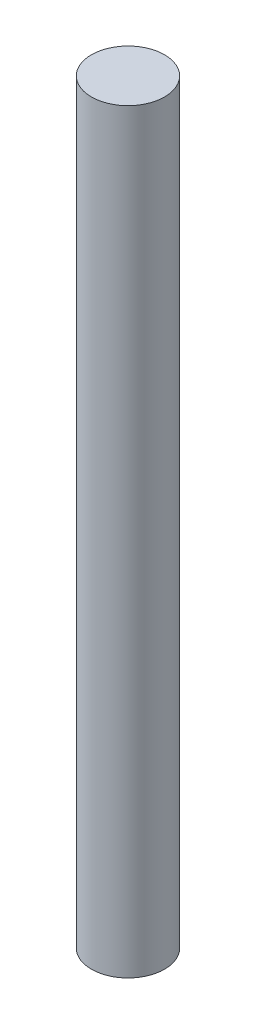
ISO-10303-21;
HEADER;
FILE_DESCRIPTION(('STEP AP214'),'2;1');
FILE_NAME('part.step','',(''),(''),'','','');
FILE_SCHEMA(('AUTOMOTIVE_DESIGN { 1 0 10303 214 1 1 1 1 }'));
ENDSEC;
DATA;
#1=APPLICATION_CONTEXT('core data for automotive mechanical design processes');
#2=APPLICATION_PROTOCOL_DEFINITION('international standard','automotive_design',2000,#1);
#3=PRODUCT_CONTEXT('',#1,'mechanical');
#4=PRODUCT('Part','Part','',(#3));
#5=PRODUCT_RELATED_PRODUCT_CATEGORY('part','',(#4));
#6=PRODUCT_DEFINITION_FORMATION('','',#4);
#7=PRODUCT_DEFINITION_CONTEXT('part definition',#1,'design');
#8=PRODUCT_DEFINITION('design','',#6,#7);
#9=PRODUCT_DEFINITION_SHAPE('','',#8);
#10=(LENGTH_UNIT() NAMED_UNIT(*) SI_UNIT(.MILLI.,.METRE.));
#11=(NAMED_UNIT(*) PLANE_ANGLE_UNIT() SI_UNIT($,.RADIAN.));
#12=(NAMED_UNIT(*) SI_UNIT($,.STERADIAN.) SOLID_ANGLE_UNIT());
#13=UNCERTAINTY_MEASURE_WITH_UNIT(LENGTH_MEASURE(1.E-05),#10,'distance_accuracy_value','');
#14=(GEOMETRIC_REPRESENTATION_CONTEXT(3) GLOBAL_UNCERTAINTY_ASSIGNED_CONTEXT((#13)) GLOBAL_UNIT_ASSIGNED_CONTEXT((#10,
#11,#12)) REPRESENTATION_CONTEXT('',''));
#15=CARTESIAN_POINT('',(0.,0.,0.));
#16=DIRECTION('',(0.,0.,1.));
#17=DIRECTION('',(1.,0.,0.));
#18=AXIS2_PLACEMENT_3D('',#15,#16,#17);
#19=CARTESIAN_POINT('',(0.,62.,0.));
#20=DIRECTION('',(0.,-1.,0.));
#21=DIRECTION('',(0.,0.,-1.));
#22=AXIS2_PLACEMENT_3D('',#19,#20,#21);
#23=CYLINDRICAL_SURFACE('',#22,3.);
#24=CARTESIAN_POINT('',(0.,62.,0.));
#25=DIRECTION('',(0.,1.,0.));
#26=DIRECTION('',(0.,0.,1.));
#27=AXIS2_PLACEMENT_3D('',#24,#25,#26);
#28=CIRCLE('',#27,3.);
#29=CARTESIAN_POINT('',(0.,62.,3.));
#30=VERTEX_POINT('',#29);
#31=EDGE_CURVE('E10',#30,#30,#28,.T.);
#32=ORIENTED_EDGE('',*,*,#31,.F.);
#33=EDGE_LOOP('',(#32));
#34=FACE_BOUND('',#33,.T.);
#35=CARTESIAN_POINT('',(0.,0.,0.));
#36=DIRECTION('',(0.,1.,0.));
#37=DIRECTION('',(0.,0.,1.));
#38=AXIS2_PLACEMENT_3D('',#35,#36,#37);
#39=CIRCLE('',#38,3.);
#40=CARTESIAN_POINT('',(0.,0.,3.));
#41=VERTEX_POINT('',#40);
#42=EDGE_CURVE('E40',#41,#41,#39,.T.);
#43=ORIENTED_EDGE('',*,*,#42,.T.);
#44=EDGE_LOOP('',(#43));
#45=FACE_BOUND('',#44,.T.);
#46=ADVANCED_FACE('F37',(#34,#45),#23,.T.);
#47=CARTESIAN_POINT('',(0.,62.,0.));
#48=DIRECTION('',(0.,1.,0.));
#49=DIRECTION('',(0.,0.,1.));
#50=AXIS2_PLACEMENT_3D('',#47,#48,#49);
#51=PLANE('',#50);
#52=ORIENTED_EDGE('',*,*,#31,.T.);
#53=EDGE_LOOP('',(#52));
#54=FACE_BOUND('',#53,.T.);
#55=ADVANCED_FACE('F54',(#54),#51,.T.);
#56=CARTESIAN_POINT('',(0.,0.,0.));
#57=DIRECTION('',(0.,1.,0.));
#58=DIRECTION('',(0.,0.,1.));
#59=AXIS2_PLACEMENT_3D('',#56,#57,#58);
#60=PLANE('',#59);
#61=ORIENTED_EDGE('',*,*,#42,.F.);
#62=EDGE_LOOP('',(#61));
#63=FACE_BOUND('',#62,.T.);
#64=ADVANCED_FACE('F52',(#63),#60,.F.);
#65=CLOSED_SHELL('',(#46,#55,#64));
#66=MANIFOLD_SOLID_BREP('B2',#65);
#67=ADVANCED_BREP_SHAPE_REPRESENTATION('',(#18,#66),#14);
#68=SHAPE_DEFINITION_REPRESENTATION(#9,#67);
ENDSEC;
END-ISO-10303-21;
